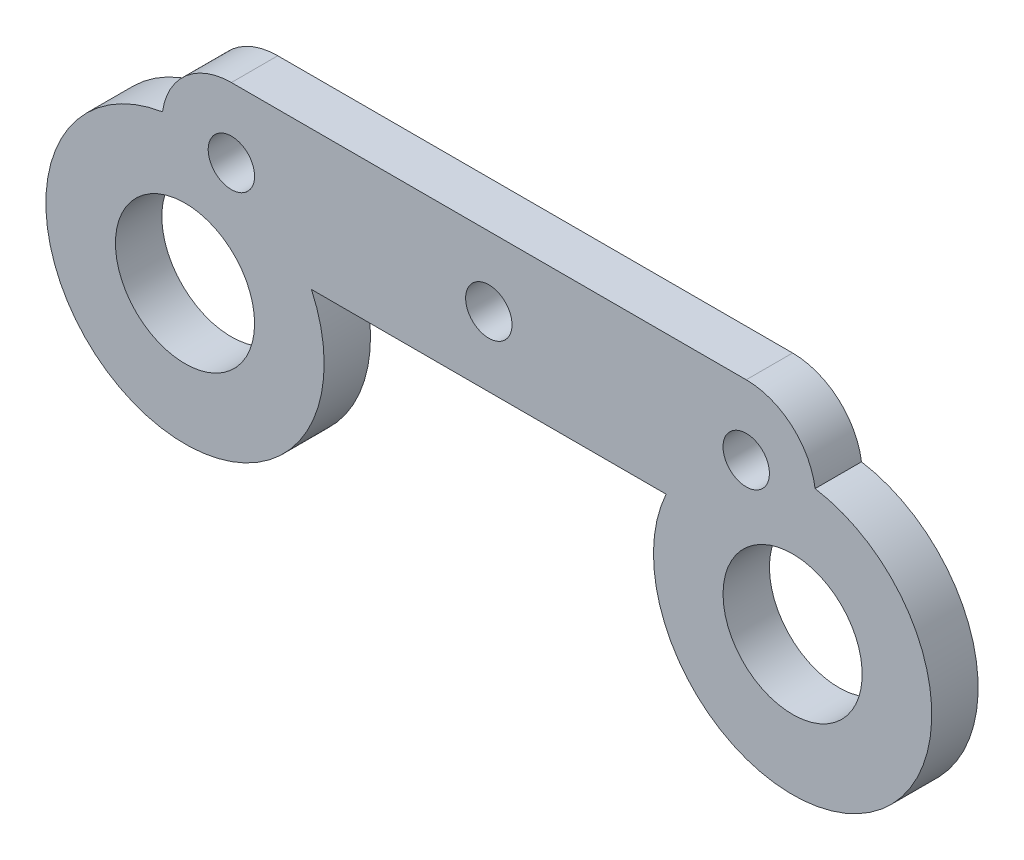
ISO-10303-21;
HEADER;
FILE_DESCRIPTION(('STEP AP214'),'2;1');
FILE_NAME('part.step','',(''),(''),'','','');
FILE_SCHEMA(('AUTOMOTIVE_DESIGN { 1 0 10303 214 1 1 1 1 }'));
ENDSEC;
DATA;
#1=APPLICATION_CONTEXT('core data for automotive mechanical design processes');
#2=APPLICATION_PROTOCOL_DEFINITION('international standard','automotive_design',2000,#1);
#3=PRODUCT_CONTEXT('',#1,'mechanical');
#4=PRODUCT('Part','Part','',(#3));
#5=PRODUCT_RELATED_PRODUCT_CATEGORY('part','',(#4));
#6=PRODUCT_DEFINITION_FORMATION('','',#4);
#7=PRODUCT_DEFINITION_CONTEXT('part definition',#1,'design');
#8=PRODUCT_DEFINITION('design','',#6,#7);
#9=PRODUCT_DEFINITION_SHAPE('','',#8);
#10=(LENGTH_UNIT() NAMED_UNIT(*) SI_UNIT(.MILLI.,.METRE.));
#11=(NAMED_UNIT(*) PLANE_ANGLE_UNIT() SI_UNIT($,.RADIAN.));
#12=(NAMED_UNIT(*) SI_UNIT($,.STERADIAN.) SOLID_ANGLE_UNIT());
#13=UNCERTAINTY_MEASURE_WITH_UNIT(LENGTH_MEASURE(1.E-05),#10,'distance_accuracy_value','');
#14=(GEOMETRIC_REPRESENTATION_CONTEXT(3) GLOBAL_UNCERTAINTY_ASSIGNED_CONTEXT((#13)) GLOBAL_UNIT_ASSIGNED_CONTEXT((#10,
#11,#12)) REPRESENTATION_CONTEXT('',''));
#15=CARTESIAN_POINT('',(0.,0.,0.));
#16=DIRECTION('',(0.,0.,1.));
#17=DIRECTION('',(1.,0.,0.));
#18=AXIS2_PLACEMENT_3D('',#15,#16,#17);
#19=CARTESIAN_POINT('',(11.1001903742506,0.,2.));
#20=DIRECTION('',(0.,0.,1.));
#21=DIRECTION('',(1.,0.,0.));
#22=AXIS2_PLACEMENT_3D('',#19,#20,#21);
#23=PLANE('',#22);
#24=CARTESIAN_POINT('',(-11.1001903742506,0.,2.));
#25=DIRECTION('',(0.,0.,1.));
#26=DIRECTION('',(1.,0.,0.));
#27=AXIS2_PLACEMENT_3D('',#24,#25,#26);
#28=CIRCLE('',#27,0.999999999999913);
#29=CARTESIAN_POINT('',(-10.1001903742507,0.,2.));
#30=VERTEX_POINT('',#29);
#31=EDGE_CURVE('E205',#30,#30,#28,.T.);
#32=ORIENTED_EDGE('',*,*,#31,.F.);
#33=EDGE_LOOP('',(#32));
#34=FACE_BOUND('',#33,.T.);
#35=CARTESIAN_POINT('',(13.1001903742511,-5.49999999999931,2.));
#36=DIRECTION('',(0.,0.,1.));
#37=DIRECTION('',(-1.,0.,0.));
#38=AXIS2_PLACEMENT_3D('',#35,#36,#37);
#39=CIRCLE('',#38,3.);
#40=CARTESIAN_POINT('',(10.1001903742511,-5.49999999999931,2.));
#41=VERTEX_POINT('',#40);
#42=EDGE_CURVE('E217',#41,#41,#39,.T.);
#43=ORIENTED_EDGE('',*,*,#42,.F.);
#44=EDGE_LOOP('',(#43));
#45=FACE_BOUND('',#44,.T.);
#46=CARTESIAN_POINT('',(11.1001903742506,0.,2.));
#47=DIRECTION('',(0.,0.,1.));
#48=DIRECTION('',(1.,0.,0.));
#49=AXIS2_PLACEMENT_3D('',#46,#47,#48);
#50=CIRCLE('',#49,3.);
#51=CARTESIAN_POINT('',(14.0705002353822,0.421021767685034,2.));
#52=VERTEX_POINT('',#51);
#53=CARTESIAN_POINT('',(11.1001903742505,3.,2.));
#54=VERTEX_POINT('',#53);
#55=EDGE_CURVE('E128',#52,#54,#50,.T.);
#56=ORIENTED_EDGE('',*,*,#55,.T.);
#57=DIRECTION('',(-1.,0.,0.));
#58=VECTOR('',#57,1.);
#59=CARTESIAN_POINT('',(-11.1001903742505,3.,2.));
#60=LINE('',#59,#58);
#61=CARTESIAN_POINT('',(-11.1001903742505,3.,2.));
#62=VERTEX_POINT('',#61);
#63=EDGE_CURVE('E86',#54,#62,#60,.T.);
#64=ORIENTED_EDGE('',*,*,#63,.T.);
#65=CARTESIAN_POINT('',(-11.1001903742506,0.,2.));
#66=DIRECTION('',(0.,0.,1.));
#67=DIRECTION('',(1.,0.,0.));
#68=AXIS2_PLACEMENT_3D('',#65,#66,#67);
#69=CIRCLE('',#68,3.);
#70=CARTESIAN_POINT('',(-14.0705002353822,0.421021767684888,2.));
#71=VERTEX_POINT('',#70);
#72=EDGE_CURVE('E99',#62,#71,#69,.T.);
#73=ORIENTED_EDGE('',*,*,#72,.T.);
#74=CARTESIAN_POINT('',(-13.100190374251,-5.49999999999942,2.));
#75=DIRECTION('',(0.,0.,1.));
#76=DIRECTION('',(1.,0.,0.));
#77=AXIS2_PLACEMENT_3D('',#74,#75,#76);
#78=CIRCLE('',#77,5.99999999999999);
#79=CARTESIAN_POINT('',(-7.64583431693364,-2.99999999999836,2.));
#80=VERTEX_POINT('',#79);
#81=EDGE_CURVE('E93',#71,#80,#78,.T.);
#82=ORIENTED_EDGE('',*,*,#81,.T.);
#83=DIRECTION('',(1.,0.,0.));
#84=VECTOR('',#83,1.);
#85=CARTESIAN_POINT('',(-7.64583431693364,-2.99999999999836,2.));
#86=LINE('',#85,#84);
#87=CARTESIAN_POINT('',(7.64583431693369,-2.99999999999836,2.));
#88=VERTEX_POINT('',#87);
#89=EDGE_CURVE('E97',#80,#88,#86,.T.);
#90=ORIENTED_EDGE('',*,*,#89,.T.);
#91=CARTESIAN_POINT('',(13.1001903742511,-5.49999999999931,2.));
#92=DIRECTION('',(0.,0.,1.));
#93=DIRECTION('',(1.,0.,0.));
#94=AXIS2_PLACEMENT_3D('',#91,#92,#93);
#95=CIRCLE('',#94,6.);
#96=EDGE_CURVE('E49',#88,#52,#95,.T.);
#97=ORIENTED_EDGE('',*,*,#96,.T.);
#98=EDGE_LOOP('',(#56,#64,#73,#82,#90,#97));
#99=FACE_BOUND('',#98,.T.);
#100=CARTESIAN_POINT('',(0.,0.,2.));
#101=DIRECTION('',(0.,0.,1.));
#102=DIRECTION('',(1.,0.,0.));
#103=AXIS2_PLACEMENT_3D('',#100,#101,#102);
#104=CIRCLE('',#103,1.);
#105=CARTESIAN_POINT('',(1.,0.,2.));
#106=VERTEX_POINT('',#105);
#107=EDGE_CURVE('E121',#106,#106,#104,.T.);
#108=ORIENTED_EDGE('',*,*,#107,.F.);
#109=EDGE_LOOP('',(#108));
#110=FACE_BOUND('',#109,.T.);
#111=CARTESIAN_POINT('',(-13.100190374251,-5.49999999999942,2.));
#112=DIRECTION('',(0.,0.,1.));
#113=DIRECTION('',(1.,0.,0.));
#114=AXIS2_PLACEMENT_3D('',#111,#112,#113);
#115=CIRCLE('',#114,3.);
#116=CARTESIAN_POINT('',(-10.100190374251,-5.49999999999942,2.));
#117=VERTEX_POINT('',#116);
#118=EDGE_CURVE('E211',#117,#117,#115,.T.);
#119=ORIENTED_EDGE('',*,*,#118,.F.);
#120=EDGE_LOOP('',(#119));
#121=FACE_BOUND('',#120,.T.);
#122=CARTESIAN_POINT('',(11.1001903742506,0.,2.));
#123=DIRECTION('',(0.,0.,1.));
#124=DIRECTION('',(-1.,0.,0.));
#125=AXIS2_PLACEMENT_3D('',#122,#123,#124);
#126=CIRCLE('',#125,1.00000000000005);
#127=CARTESIAN_POINT('',(10.1001903742506,0.,2.));
#128=VERTEX_POINT('',#127);
#129=EDGE_CURVE('E197',#128,#128,#126,.T.);
#130=ORIENTED_EDGE('',*,*,#129,.F.);
#131=EDGE_LOOP('',(#130));
#132=FACE_BOUND('',#131,.T.);
#133=ADVANCED_FACE('F32',(#34,#45,#99,#110,#121,#132),#23,.T.);
#134=CARTESIAN_POINT('',(11.1001903742506,0.,0.));
#135=DIRECTION('',(0.,0.,1.));
#136=DIRECTION('',(1.,0.,0.));
#137=AXIS2_PLACEMENT_3D('',#134,#135,#136);
#138=PLANE('',#137);
#139=CARTESIAN_POINT('',(-11.1001903742506,0.,0.));
#140=DIRECTION('',(0.,0.,1.));
#141=DIRECTION('',(1.,0.,0.));
#142=AXIS2_PLACEMENT_3D('',#139,#140,#141);
#143=CIRCLE('',#142,0.999999999999913);
#144=CARTESIAN_POINT('',(-10.1001903742507,0.,0.));
#145=VERTEX_POINT('',#144);
#146=EDGE_CURVE('E203',#145,#145,#143,.T.);
#147=ORIENTED_EDGE('',*,*,#146,.T.);
#148=EDGE_LOOP('',(#147));
#149=FACE_BOUND('',#148,.T.);
#150=CARTESIAN_POINT('',(13.1001903742511,-5.49999999999931,0.));
#151=DIRECTION('',(0.,0.,1.));
#152=DIRECTION('',(-1.,0.,0.));
#153=AXIS2_PLACEMENT_3D('',#150,#151,#152);
#154=CIRCLE('',#153,3.);
#155=CARTESIAN_POINT('',(10.1001903742511,-5.49999999999931,0.));
#156=VERTEX_POINT('',#155);
#157=EDGE_CURVE('E214',#156,#156,#154,.T.);
#158=ORIENTED_EDGE('',*,*,#157,.T.);
#159=EDGE_LOOP('',(#158));
#160=FACE_BOUND('',#159,.T.);
#161=CARTESIAN_POINT('',(11.1001903742506,0.,0.));
#162=DIRECTION('',(0.,0.,1.));
#163=DIRECTION('',(1.,0.,0.));
#164=AXIS2_PLACEMENT_3D('',#161,#162,#163);
#165=CIRCLE('',#164,3.);
#166=CARTESIAN_POINT('',(14.0705002353822,0.421021767685034,0.));
#167=VERTEX_POINT('',#166);
#168=CARTESIAN_POINT('',(11.1001903742505,3.,0.));
#169=VERTEX_POINT('',#168);
#170=EDGE_CURVE('E117',#167,#169,#165,.T.);
#171=ORIENTED_EDGE('',*,*,#170,.F.);
#172=CARTESIAN_POINT('',(13.1001903742511,-5.49999999999931,0.));
#173=DIRECTION('',(0.,0.,1.));
#174=DIRECTION('',(1.,0.,0.));
#175=AXIS2_PLACEMENT_3D('',#172,#173,#174);
#176=CIRCLE('',#175,6.);
#177=CARTESIAN_POINT('',(7.64583431693369,-2.99999999999836,0.));
#178=VERTEX_POINT('',#177);
#179=EDGE_CURVE('E78',#178,#167,#176,.T.);
#180=ORIENTED_EDGE('',*,*,#179,.F.);
#181=DIRECTION('',(1.,0.,0.));
#182=VECTOR('',#181,1.);
#183=CARTESIAN_POINT('',(-7.64583431693364,-2.99999999999836,0.));
#184=LINE('',#183,#182);
#185=CARTESIAN_POINT('',(-7.64583431693364,-2.99999999999836,0.));
#186=VERTEX_POINT('',#185);
#187=EDGE_CURVE('E72',#186,#178,#184,.T.);
#188=ORIENTED_EDGE('',*,*,#187,.F.);
#189=CARTESIAN_POINT('',(-13.100190374251,-5.49999999999942,0.));
#190=DIRECTION('',(0.,0.,1.));
#191=DIRECTION('',(1.,0.,0.));
#192=AXIS2_PLACEMENT_3D('',#189,#190,#191);
#193=CIRCLE('',#192,5.99999999999999);
#194=CARTESIAN_POINT('',(-14.0705002353822,0.421021767684888,0.));
#195=VERTEX_POINT('',#194);
#196=EDGE_CURVE('E107',#195,#186,#193,.T.);
#197=ORIENTED_EDGE('',*,*,#196,.F.);
#198=CARTESIAN_POINT('',(-11.1001903742506,0.,0.));
#199=DIRECTION('',(0.,0.,1.));
#200=DIRECTION('',(1.,0.,0.));
#201=AXIS2_PLACEMENT_3D('',#198,#199,#200);
#202=CIRCLE('',#201,3.);
#203=CARTESIAN_POINT('',(-11.1001903742505,3.,0.));
#204=VERTEX_POINT('',#203);
#205=EDGE_CURVE('E123',#204,#195,#202,.T.);
#206=ORIENTED_EDGE('',*,*,#205,.F.);
#207=DIRECTION('',(-1.,0.,0.));
#208=VECTOR('',#207,1.);
#209=CARTESIAN_POINT('',(-11.1001903742505,3.,0.));
#210=LINE('',#209,#208);
#211=EDGE_CURVE('E120',#169,#204,#210,.T.);
#212=ORIENTED_EDGE('',*,*,#211,.F.);
#213=EDGE_LOOP('',(#171,#180,#188,#197,#206,#212));
#214=FACE_BOUND('',#213,.T.);
#215=CARTESIAN_POINT('',(0.,0.,0.));
#216=DIRECTION('',(0.,0.,1.));
#217=DIRECTION('',(1.,0.,0.));
#218=AXIS2_PLACEMENT_3D('',#215,#216,#217);
#219=CIRCLE('',#218,1.);
#220=CARTESIAN_POINT('',(1.,0.,0.));
#221=VERTEX_POINT('',#220);
#222=EDGE_CURVE('E220',#221,#221,#219,.T.);
#223=ORIENTED_EDGE('',*,*,#222,.T.);
#224=EDGE_LOOP('',(#223));
#225=FACE_BOUND('',#224,.T.);
#226=CARTESIAN_POINT('',(-13.100190374251,-5.49999999999942,0.));
#227=DIRECTION('',(0.,0.,1.));
#228=DIRECTION('',(1.,0.,0.));
#229=AXIS2_PLACEMENT_3D('',#226,#227,#228);
#230=CIRCLE('',#229,3.);
#231=CARTESIAN_POINT('',(-10.100190374251,-5.49999999999942,0.));
#232=VERTEX_POINT('',#231);
#233=EDGE_CURVE('E208',#232,#232,#230,.T.);
#234=ORIENTED_EDGE('',*,*,#233,.T.);
#235=EDGE_LOOP('',(#234));
#236=FACE_BOUND('',#235,.T.);
#237=CARTESIAN_POINT('',(11.1001903742506,0.,0.));
#238=DIRECTION('',(0.,0.,1.));
#239=DIRECTION('',(-1.,0.,0.));
#240=AXIS2_PLACEMENT_3D('',#237,#238,#239);
#241=CIRCLE('',#240,1.00000000000005);
#242=CARTESIAN_POINT('',(10.1001903742506,0.,0.));
#243=VERTEX_POINT('',#242);
#244=EDGE_CURVE('E193',#243,#243,#241,.T.);
#245=ORIENTED_EDGE('',*,*,#244,.T.);
#246=EDGE_LOOP('',(#245));
#247=FACE_BOUND('',#246,.T.);
#248=ADVANCED_FACE('F137',(#149,#160,#214,#225,#236,#247),#138,.F.);
#249=CARTESIAN_POINT('',(11.1001903742506,0.,2.));
#250=DIRECTION('',(0.,0.,-1.));
#251=DIRECTION('',(-1.,0.,0.));
#252=AXIS2_PLACEMENT_3D('',#249,#250,#251);
#253=CYLINDRICAL_SURFACE('',#252,3.);
#254=ORIENTED_EDGE('',*,*,#170,.T.);
#255=DIRECTION('',(0.,0.,-1.));
#256=VECTOR('',#255,1.);
#257=CARTESIAN_POINT('',(11.1001903742505,3.,2.));
#258=LINE('',#257,#256);
#259=EDGE_CURVE('E11',#54,#169,#258,.T.);
#260=ORIENTED_EDGE('',*,*,#259,.F.);
#261=ORIENTED_EDGE('',*,*,#55,.F.);
#262=DIRECTION('',(0.,0.,-1.));
#263=VECTOR('',#262,1.);
#264=CARTESIAN_POINT('',(14.0705002353822,0.421021767685034,2.));
#265=LINE('',#264,#263);
#266=EDGE_CURVE('E113',#52,#167,#265,.T.);
#267=ORIENTED_EDGE('',*,*,#266,.T.);
#268=EDGE_LOOP('',(#254,#260,#261,#267));
#269=FACE_BOUND('',#268,.T.);
#270=ADVANCED_FACE('F34',(#269),#253,.T.);
#271=CARTESIAN_POINT('',(-11.1001903742505,3.,2.));
#272=DIRECTION('',(0.,-1.,0.));
#273=DIRECTION('',(0.,0.,-1.));
#274=AXIS2_PLACEMENT_3D('',#271,#272,#273);
#275=PLANE('',#274);
#276=ORIENTED_EDGE('',*,*,#211,.T.);
#277=DIRECTION('',(0.,0.,-1.));
#278=VECTOR('',#277,1.);
#279=CARTESIAN_POINT('',(-11.1001903742505,3.,2.));
#280=LINE('',#279,#278);
#281=EDGE_CURVE('E41',#62,#204,#280,.T.);
#282=ORIENTED_EDGE('',*,*,#281,.F.);
#283=ORIENTED_EDGE('',*,*,#63,.F.);
#284=ORIENTED_EDGE('',*,*,#259,.T.);
#285=EDGE_LOOP('',(#276,#282,#283,#284));
#286=FACE_BOUND('',#285,.T.);
#287=ADVANCED_FACE('F296',(#286),#275,.F.);
#288=CARTESIAN_POINT('',(-11.1001903742506,0.,2.));
#289=DIRECTION('',(0.,0.,-1.));
#290=DIRECTION('',(-1.,0.,0.));
#291=AXIS2_PLACEMENT_3D('',#288,#289,#290);
#292=CYLINDRICAL_SURFACE('',#291,3.);
#293=ORIENTED_EDGE('',*,*,#205,.T.);
#294=DIRECTION('',(0.,0.,-1.));
#295=VECTOR('',#294,1.);
#296=CARTESIAN_POINT('',(-14.0705002353822,0.421021767684888,2.));
#297=LINE('',#296,#295);
#298=EDGE_CURVE('E108',#71,#195,#297,.T.);
#299=ORIENTED_EDGE('',*,*,#298,.F.);
#300=ORIENTED_EDGE('',*,*,#72,.F.);
#301=ORIENTED_EDGE('',*,*,#281,.T.);
#302=EDGE_LOOP('',(#293,#299,#300,#301));
#303=FACE_BOUND('',#302,.T.);
#304=ADVANCED_FACE('F134',(#303),#292,.T.);
#305=CARTESIAN_POINT('',(-13.100190374251,-5.49999999999942,2.));
#306=DIRECTION('',(0.,0.,-1.));
#307=DIRECTION('',(-1.,0.,0.));
#308=AXIS2_PLACEMENT_3D('',#305,#306,#307);
#309=CYLINDRICAL_SURFACE('',#308,5.99999999999999);
#310=ORIENTED_EDGE('',*,*,#196,.T.);
#311=DIRECTION('',(0.,0.,-1.));
#312=VECTOR('',#311,1.);
#313=CARTESIAN_POINT('',(-7.64583431693364,-2.99999999999836,2.));
#314=LINE('',#313,#312);
#315=EDGE_CURVE('E104',#80,#186,#314,.T.);
#316=ORIENTED_EDGE('',*,*,#315,.F.);
#317=ORIENTED_EDGE('',*,*,#81,.F.);
#318=ORIENTED_EDGE('',*,*,#298,.T.);
#319=EDGE_LOOP('',(#310,#316,#317,#318));
#320=FACE_BOUND('',#319,.T.);
#321=ADVANCED_FACE('F105',(#320),#309,.T.);
#322=CARTESIAN_POINT('',(-7.64583431693364,-2.99999999999836,2.));
#323=DIRECTION('',(0.,1.,0.));
#324=DIRECTION('',(0.,0.,1.));
#325=AXIS2_PLACEMENT_3D('',#322,#323,#324);
#326=PLANE('',#325);
#327=CARTESIAN_POINT('',(0.,-2.99999999999836,1.));
#328=DIRECTION('',(0.,-1.,0.));
#329=DIRECTION('',(0.,0.,-1.));
#330=AXIS2_PLACEMENT_3D('',#327,#328,#329);
#331=CIRCLE('',#330,0.5);
#332=CARTESIAN_POINT('',(0.,-2.99999999999836,0.5));
#333=VERTEX_POINT('',#332);
#334=EDGE_CURVE('E194',#333,#333,#331,.T.);
#335=ORIENTED_EDGE('',*,*,#334,.F.);
#336=EDGE_LOOP('',(#335));
#337=FACE_BOUND('',#336,.T.);
#338=ORIENTED_EDGE('',*,*,#187,.T.);
#339=DIRECTION('',(0.,0.,-1.));
#340=VECTOR('',#339,1.);
#341=CARTESIAN_POINT('',(7.64583431693369,-2.99999999999836,2.));
#342=LINE('',#341,#340);
#343=EDGE_CURVE('E109',#88,#178,#342,.T.);
#344=ORIENTED_EDGE('',*,*,#343,.F.);
#345=ORIENTED_EDGE('',*,*,#89,.F.);
#346=ORIENTED_EDGE('',*,*,#315,.T.);
#347=EDGE_LOOP('',(#338,#344,#345,#346));
#348=FACE_BOUND('',#347,.T.);
#349=ADVANCED_FACE('F111',(#337,#348),#326,.F.);
#350=CARTESIAN_POINT('',(13.1001903742511,-5.49999999999931,2.));
#351=DIRECTION('',(0.,0.,-1.));
#352=DIRECTION('',(-1.,0.,0.));
#353=AXIS2_PLACEMENT_3D('',#350,#351,#352);
#354=CYLINDRICAL_SURFACE('',#353,6.);
#355=ORIENTED_EDGE('',*,*,#179,.T.);
#356=ORIENTED_EDGE('',*,*,#266,.F.);
#357=ORIENTED_EDGE('',*,*,#96,.F.);
#358=ORIENTED_EDGE('',*,*,#343,.T.);
#359=EDGE_LOOP('',(#355,#356,#357,#358));
#360=FACE_BOUND('',#359,.T.);
#361=ADVANCED_FACE('F142',(#360),#354,.T.);
#362=CARTESIAN_POINT('',(0.,0.,2.));
#363=DIRECTION('',(0.,0.,-1.));
#364=DIRECTION('',(-1.,0.,0.));
#365=AXIS2_PLACEMENT_3D('',#362,#363,#364);
#366=CYLINDRICAL_SURFACE('',#365,1.);
#367=ORIENTED_EDGE('',*,*,#107,.T.);
#368=EDGE_LOOP('',(#367));
#369=FACE_BOUND('',#368,.T.);
#370=ORIENTED_EDGE('',*,*,#222,.F.);
#371=EDGE_LOOP('',(#370));
#372=FACE_BOUND('',#371,.T.);
#373=ADVANCED_FACE('F144',(#369,#372),#366,.F.);
#374=CARTESIAN_POINT('',(13.1001903742511,-5.49999999999931,2.));
#375=DIRECTION('',(0.,0.,-1.));
#376=DIRECTION('',(-1.,0.,0.));
#377=AXIS2_PLACEMENT_3D('',#374,#375,#376);
#378=CYLINDRICAL_SURFACE('',#377,3.);
#379=ORIENTED_EDGE('',*,*,#42,.T.);
#380=EDGE_LOOP('',(#379));
#381=FACE_BOUND('',#380,.T.);
#382=ORIENTED_EDGE('',*,*,#157,.F.);
#383=EDGE_LOOP('',(#382));
#384=FACE_BOUND('',#383,.T.);
#385=ADVANCED_FACE('F150',(#381,#384),#378,.F.);
#386=CARTESIAN_POINT('',(-13.100190374251,-5.49999999999942,2.));
#387=DIRECTION('',(0.,0.,-1.));
#388=DIRECTION('',(-1.,0.,0.));
#389=AXIS2_PLACEMENT_3D('',#386,#387,#388);
#390=CYLINDRICAL_SURFACE('',#389,3.);
#391=ORIENTED_EDGE('',*,*,#118,.T.);
#392=EDGE_LOOP('',(#391));
#393=FACE_BOUND('',#392,.T.);
#394=ORIENTED_EDGE('',*,*,#233,.F.);
#395=EDGE_LOOP('',(#394));
#396=FACE_BOUND('',#395,.T.);
#397=ADVANCED_FACE('F168',(#393,#396),#390,.F.);
#398=CARTESIAN_POINT('',(-11.1001903742506,0.,2.));
#399=DIRECTION('',(0.,0.,-1.));
#400=DIRECTION('',(-1.,0.,0.));
#401=AXIS2_PLACEMENT_3D('',#398,#399,#400);
#402=CYLINDRICAL_SURFACE('',#401,0.999999999999913);
#403=ORIENTED_EDGE('',*,*,#31,.T.);
#404=EDGE_LOOP('',(#403));
#405=FACE_BOUND('',#404,.T.);
#406=ORIENTED_EDGE('',*,*,#146,.F.);
#407=EDGE_LOOP('',(#406));
#408=FACE_BOUND('',#407,.T.);
#409=ADVANCED_FACE('F172',(#405,#408),#402,.F.);
#410=CARTESIAN_POINT('',(11.1001903742506,0.,2.));
#411=DIRECTION('',(0.,0.,-1.));
#412=DIRECTION('',(-1.,0.,0.));
#413=AXIS2_PLACEMENT_3D('',#410,#411,#412);
#414=CYLINDRICAL_SURFACE('',#413,1.00000000000005);
#415=ORIENTED_EDGE('',*,*,#129,.T.);
#416=EDGE_LOOP('',(#415));
#417=FACE_BOUND('',#416,.T.);
#418=ORIENTED_EDGE('',*,*,#244,.F.);
#419=EDGE_LOOP('',(#418));
#420=FACE_BOUND('',#419,.T.);
#421=ADVANCED_FACE('F176',(#417,#420),#414,.F.);
#422=CARTESIAN_POINT('',(0.,-2.49999999999836,1.));
#423=DIRECTION('',(0.,-1.,0.));
#424=DIRECTION('',(0.,0.,-1.));
#425=AXIS2_PLACEMENT_3D('',#422,#423,#424);
#426=CYLINDRICAL_SURFACE('',#425,0.5);
#427=CARTESIAN_POINT('',(0.,-2.49999999999836,1.));
#428=DIRECTION('',(0.,-1.,0.));
#429=DIRECTION('',(0.,0.,-1.));
#430=AXIS2_PLACEMENT_3D('',#427,#428,#429);
#431=CIRCLE('',#430,0.5);
#432=CARTESIAN_POINT('',(0.,-2.49999999999836,0.5));
#433=VERTEX_POINT('',#432);
#434=EDGE_CURVE('E192',#433,#433,#431,.T.);
#435=ORIENTED_EDGE('',*,*,#434,.F.);
#436=EDGE_LOOP('',(#435));
#437=FACE_BOUND('',#436,.T.);
#438=ORIENTED_EDGE('',*,*,#334,.T.);
#439=EDGE_LOOP('',(#438));
#440=FACE_BOUND('',#439,.T.);
#441=ADVANCED_FACE('F180',(#437,#440),#426,.F.);
#442=CARTESIAN_POINT('',(0.,-2.49999999999836,1.));
#443=DIRECTION('',(0.,-1.,0.));
#444=DIRECTION('',(0.,0.,-1.));
#445=AXIS2_PLACEMENT_3D('',#442,#443,#444);
#446=PLANE('',#445);
#447=ORIENTED_EDGE('',*,*,#434,.T.);
#448=EDGE_LOOP('',(#447));
#449=FACE_BOUND('',#448,.T.);
#450=ADVANCED_FACE('F184',(#449),#446,.T.);
#451=CLOSED_SHELL('',(#133,#248,#270,#287,#304,#321,#349,#361,#373,#385,#397,#409,#421,#441,#450));
#452=MANIFOLD_SOLID_BREP('B2',#451);
#453=ADVANCED_BREP_SHAPE_REPRESENTATION('',(#18,#452),#14);
#454=SHAPE_DEFINITION_REPRESENTATION(#9,#453);
ENDSEC;
END-ISO-10303-21;
